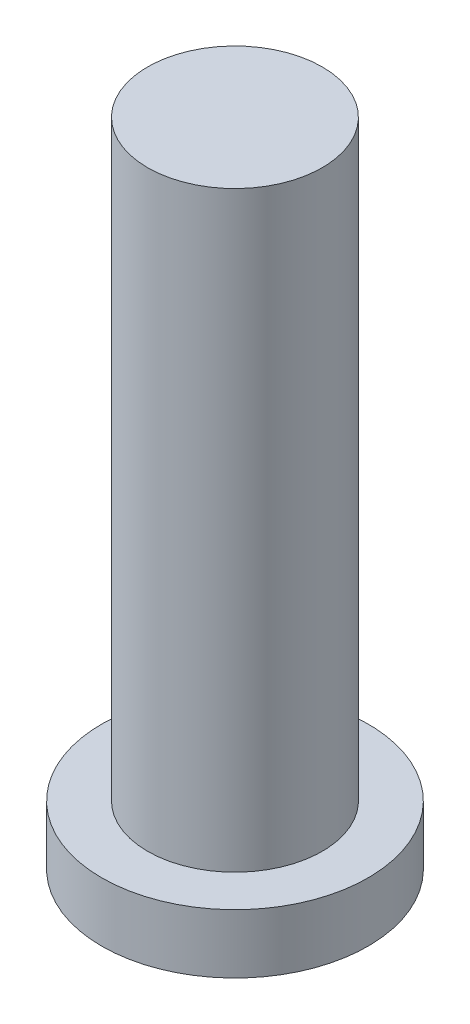
ISO-10303-21;
HEADER;
FILE_DESCRIPTION(('STEP AP214'),'2;1');
FILE_NAME('part.step','',(''),(''),'','','');
FILE_SCHEMA(('AUTOMOTIVE_DESIGN { 1 0 10303 214 1 1 1 1 }'));
ENDSEC;
DATA;
#1=APPLICATION_CONTEXT('core data for automotive mechanical design processes');
#2=APPLICATION_PROTOCOL_DEFINITION('international standard','automotive_design',2000,#1);
#3=PRODUCT_CONTEXT('',#1,'mechanical');
#4=PRODUCT('Part','Part','',(#3));
#5=PRODUCT_RELATED_PRODUCT_CATEGORY('part','',(#4));
#6=PRODUCT_DEFINITION_FORMATION('','',#4);
#7=PRODUCT_DEFINITION_CONTEXT('part definition',#1,'design');
#8=PRODUCT_DEFINITION('design','',#6,#7);
#9=PRODUCT_DEFINITION_SHAPE('','',#8);
#10=(LENGTH_UNIT() NAMED_UNIT(*) SI_UNIT(.MILLI.,.METRE.));
#11=(NAMED_UNIT(*) PLANE_ANGLE_UNIT() SI_UNIT($,.RADIAN.));
#12=(NAMED_UNIT(*) SI_UNIT($,.STERADIAN.) SOLID_ANGLE_UNIT());
#13=UNCERTAINTY_MEASURE_WITH_UNIT(LENGTH_MEASURE(1.E-05),#10,'distance_accuracy_value','');
#14=(GEOMETRIC_REPRESENTATION_CONTEXT(3) GLOBAL_UNCERTAINTY_ASSIGNED_CONTEXT((#13)) GLOBAL_UNIT_ASSIGNED_CONTEXT((#10,
#11,#12)) REPRESENTATION_CONTEXT('',''));
#15=CARTESIAN_POINT('',(0.,0.,0.));
#16=DIRECTION('',(0.,0.,1.));
#17=DIRECTION('',(1.,0.,0.));
#18=AXIS2_PLACEMENT_3D('',#15,#16,#17);
#19=CARTESIAN_POINT('',(0.,2.,0.));
#20=DIRECTION('',(0.,-1.,0.));
#21=DIRECTION('',(0.,0.,-1.));
#22=AXIS2_PLACEMENT_3D('',#19,#20,#21);
#23=CYLINDRICAL_SURFACE('',#22,4.5);
#24=CARTESIAN_POINT('',(0.,2.,0.));
#25=DIRECTION('',(0.,1.,0.));
#26=DIRECTION('',(0.,0.,1.));
#27=AXIS2_PLACEMENT_3D('',#24,#25,#26);
#28=CIRCLE('',#27,4.5);
#29=CARTESIAN_POINT('',(0.,2.,4.5));
#30=VERTEX_POINT('',#29);
#31=EDGE_CURVE('E42',#30,#30,#28,.T.);
#32=ORIENTED_EDGE('',*,*,#31,.F.);
#33=EDGE_LOOP('',(#32));
#34=FACE_BOUND('',#33,.T.);
#35=CARTESIAN_POINT('',(0.,0.,0.));
#36=DIRECTION('',(0.,1.,0.));
#37=DIRECTION('',(0.,0.,1.));
#38=AXIS2_PLACEMENT_3D('',#35,#36,#37);
#39=CIRCLE('',#38,4.5);
#40=CARTESIAN_POINT('',(0.,0.,4.5));
#41=VERTEX_POINT('',#40);
#42=EDGE_CURVE('E38',#41,#41,#39,.T.);
#43=ORIENTED_EDGE('',*,*,#42,.T.);
#44=EDGE_LOOP('',(#43));
#45=FACE_BOUND('',#44,.T.);
#46=ADVANCED_FACE('F35',(#34,#45),#23,.T.);
#47=CARTESIAN_POINT('',(0.,2.,0.));
#48=DIRECTION('',(0.,1.,0.));
#49=DIRECTION('',(0.,0.,1.));
#50=AXIS2_PLACEMENT_3D('',#47,#48,#49);
#51=PLANE('',#50);
#52=CARTESIAN_POINT('',(0.,2.,0.));
#53=DIRECTION('',(0.,1.,0.));
#54=DIRECTION('',(0.,0.,1.));
#55=AXIS2_PLACEMENT_3D('',#52,#53,#54);
#56=CIRCLE('',#55,2.95);
#57=CARTESIAN_POINT('',(0.,2.,2.95));
#58=VERTEX_POINT('',#57);
#59=EDGE_CURVE('E10',#58,#58,#56,.T.);
#60=ORIENTED_EDGE('',*,*,#59,.F.);
#61=EDGE_LOOP('',(#60));
#62=FACE_BOUND('',#61,.T.);
#63=ORIENTED_EDGE('',*,*,#31,.T.);
#64=EDGE_LOOP('',(#63));
#65=FACE_BOUND('',#64,.T.);
#66=ADVANCED_FACE('F59',(#62,#65),#51,.T.);
#67=CARTESIAN_POINT('',(0.,0.,0.));
#68=DIRECTION('',(0.,1.,0.));
#69=DIRECTION('',(0.,0.,1.));
#70=AXIS2_PLACEMENT_3D('',#67,#68,#69);
#71=PLANE('',#70);
#72=ORIENTED_EDGE('',*,*,#42,.F.);
#73=EDGE_LOOP('',(#72));
#74=FACE_BOUND('',#73,.T.);
#75=ADVANCED_FACE('F56',(#74),#71,.F.);
#76=CARTESIAN_POINT('',(0.,22.,0.));
#77=DIRECTION('',(0.,-1.,0.));
#78=DIRECTION('',(0.,0.,-1.));
#79=AXIS2_PLACEMENT_3D('',#76,#77,#78);
#80=CYLINDRICAL_SURFACE('',#79,2.95);
#81=CARTESIAN_POINT('',(0.,22.,0.));
#82=DIRECTION('',(0.,1.,0.));
#83=DIRECTION('',(0.,0.,1.));
#84=AXIS2_PLACEMENT_3D('',#81,#82,#83);
#85=CIRCLE('',#84,2.95);
#86=CARTESIAN_POINT('',(0.,22.,2.95));
#87=VERTEX_POINT('',#86);
#88=EDGE_CURVE('E48',#87,#87,#85,.T.);
#89=ORIENTED_EDGE('',*,*,#88,.F.);
#90=EDGE_LOOP('',(#89));
#91=FACE_BOUND('',#90,.T.);
#92=ORIENTED_EDGE('',*,*,#59,.T.);
#93=EDGE_LOOP('',(#92));
#94=FACE_BOUND('',#93,.T.);
#95=ADVANCED_FACE('F58',(#91,#94),#80,.T.);
#96=CARTESIAN_POINT('',(0.,22.,0.));
#97=DIRECTION('',(0.,1.,0.));
#98=DIRECTION('',(0.,0.,1.));
#99=AXIS2_PLACEMENT_3D('',#96,#97,#98);
#100=PLANE('',#99);
#101=ORIENTED_EDGE('',*,*,#88,.T.);
#102=EDGE_LOOP('',(#101));
#103=FACE_BOUND('',#102,.T.);
#104=ADVANCED_FACE('F64',(#103),#100,.T.);
#105=CLOSED_SHELL('',(#46,#66,#75,#95,#104));
#106=MANIFOLD_SOLID_BREP('B2',#105);
#107=ADVANCED_BREP_SHAPE_REPRESENTATION('',(#18,#106),#14);
#108=SHAPE_DEFINITION_REPRESENTATION(#9,#107);
ENDSEC;
END-ISO-10303-21;
